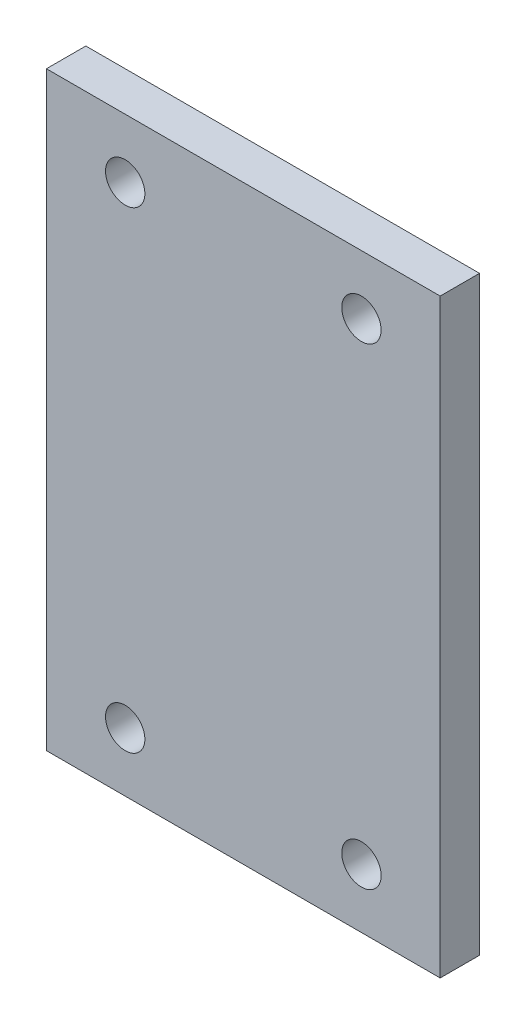
ISO-10303-21;
HEADER;
FILE_DESCRIPTION(('STEP AP214'),'2;1');
FILE_NAME('part.step','',(''),(''),'','','');
FILE_SCHEMA(('AUTOMOTIVE_DESIGN { 1 0 10303 214 1 1 1 1 }'));
ENDSEC;
DATA;
#1=APPLICATION_CONTEXT('core data for automotive mechanical design processes');
#2=APPLICATION_PROTOCOL_DEFINITION('international standard','automotive_design',2000,#1);
#3=PRODUCT_CONTEXT('',#1,'mechanical');
#4=PRODUCT('Part','Part','',(#3));
#5=PRODUCT_RELATED_PRODUCT_CATEGORY('part','',(#4));
#6=PRODUCT_DEFINITION_FORMATION('','',#4);
#7=PRODUCT_DEFINITION_CONTEXT('part definition',#1,'design');
#8=PRODUCT_DEFINITION('design','',#6,#7);
#9=PRODUCT_DEFINITION_SHAPE('','',#8);
#10=(LENGTH_UNIT() NAMED_UNIT(*) SI_UNIT(.MILLI.,.METRE.));
#11=(NAMED_UNIT(*) PLANE_ANGLE_UNIT() SI_UNIT($,.RADIAN.));
#12=(NAMED_UNIT(*) SI_UNIT($,.STERADIAN.) SOLID_ANGLE_UNIT());
#13=UNCERTAINTY_MEASURE_WITH_UNIT(LENGTH_MEASURE(1.E-05),#10,'distance_accuracy_value','');
#14=(GEOMETRIC_REPRESENTATION_CONTEXT(3) GLOBAL_UNCERTAINTY_ASSIGNED_CONTEXT((#13)) GLOBAL_UNIT_ASSIGNED_CONTEXT((#10,
#11,#12)) REPRESENTATION_CONTEXT('',''));
#15=CARTESIAN_POINT('',(0.,0.,0.));
#16=DIRECTION('',(0.,0.,1.));
#17=DIRECTION('',(1.,0.,0.));
#18=AXIS2_PLACEMENT_3D('',#15,#16,#17);
#19=CARTESIAN_POINT('',(0.,0.,5.08));
#20=DIRECTION('',(0.,0.,1.));
#21=DIRECTION('',(1.,0.,0.));
#22=AXIS2_PLACEMENT_3D('',#19,#20,#21);
#23=PLANE('',#22);
#24=CARTESIAN_POINT('',(-8.00410597528841,86.5222128549228,5.08));
#25=DIRECTION('',(0.,0.,1.));
#26=DIRECTION('',(1.,0.,0.));
#27=AXIS2_PLACEMENT_3D('',#24,#25,#26);
#28=CIRCLE('',#27,2.54);
#29=CARTESIAN_POINT('',(-5.46410597528841,86.5222128549228,5.08));
#30=VERTEX_POINT('',#29);
#31=EDGE_CURVE('E146',#30,#30,#28,.T.);
#32=ORIENTED_EDGE('',*,*,#31,.F.);
#33=EDGE_LOOP('',(#32));
#34=FACE_BOUND('',#33,.T.);
#35=CARTESIAN_POINT('',(-38.4841059752884,25.5622128549228,5.08));
#36=DIRECTION('',(0.,0.,1.));
#37=DIRECTION('',(1.,0.,0.));
#38=AXIS2_PLACEMENT_3D('',#35,#36,#37);
#39=CIRCLE('',#38,2.54);
#40=CARTESIAN_POINT('',(-35.9441059752884,25.5622128549228,5.08));
#41=VERTEX_POINT('',#40);
#42=EDGE_CURVE('E120',#41,#41,#39,.T.);
#43=ORIENTED_EDGE('',*,*,#42,.F.);
#44=EDGE_LOOP('',(#43));
#45=FACE_BOUND('',#44,.T.);
#46=DIRECTION('',(0.,1.,0.));
#47=VECTOR('',#46,1.);
#48=CARTESIAN_POINT('',(2.15589402471159,94.1422128549228,5.08));
#49=LINE('',#48,#47);
#50=CARTESIAN_POINT('',(2.15589402471159,17.9422128549228,5.08));
#51=VERTEX_POINT('',#50);
#52=CARTESIAN_POINT('',(2.15589402471159,94.1422128549228,5.08));
#53=VERTEX_POINT('',#52);
#54=EDGE_CURVE('E98',#51,#53,#49,.T.);
#55=ORIENTED_EDGE('',*,*,#54,.T.);
#56=DIRECTION('',(-1.,0.,0.));
#57=VECTOR('',#56,1.);
#58=CARTESIAN_POINT('',(-48.6441059752884,94.1422128549228,5.08));
#59=LINE('',#58,#57);
#60=CARTESIAN_POINT('',(-48.6441059752884,94.1422128549228,5.08));
#61=VERTEX_POINT('',#60);
#62=EDGE_CURVE('E91',#53,#61,#59,.T.);
#63=ORIENTED_EDGE('',*,*,#62,.T.);
#64=DIRECTION('',(0.,-1.,0.));
#65=VECTOR('',#64,1.);
#66=CARTESIAN_POINT('',(-48.6441059752884,94.1422128549228,5.08));
#67=LINE('',#66,#65);
#68=CARTESIAN_POINT('',(-48.6441059752884,17.9422128549228,5.08));
#69=VERTEX_POINT('',#68);
#70=EDGE_CURVE('E96',#61,#69,#67,.T.);
#71=ORIENTED_EDGE('',*,*,#70,.T.);
#72=DIRECTION('',(1.,0.,0.));
#73=VECTOR('',#72,1.);
#74=CARTESIAN_POINT('',(-48.6441059752884,17.9422128549228,5.08));
#75=LINE('',#74,#73);
#76=EDGE_CURVE('E65',#69,#51,#75,.T.);
#77=ORIENTED_EDGE('',*,*,#76,.T.);
#78=EDGE_LOOP('',(#55,#63,#71,#77));
#79=FACE_BOUND('',#78,.T.);
#80=CARTESIAN_POINT('',(-8.00410597528842,25.5622128549228,5.08));
#81=DIRECTION('',(0.,0.,1.));
#82=DIRECTION('',(-1.,0.,0.));
#83=AXIS2_PLACEMENT_3D('',#80,#81,#82);
#84=CIRCLE('',#83,2.54);
#85=CARTESIAN_POINT('',(-10.5441059752884,25.5622128549228,5.08));
#86=VERTEX_POINT('',#85);
#87=EDGE_CURVE('E139',#86,#86,#84,.T.);
#88=ORIENTED_EDGE('',*,*,#87,.F.);
#89=EDGE_LOOP('',(#88));
#90=FACE_BOUND('',#89,.T.);
#91=CARTESIAN_POINT('',(-38.4841059752884,86.5222128549228,5.08));
#92=DIRECTION('',(0.,0.,1.));
#93=DIRECTION('',(-1.,0.,0.));
#94=AXIS2_PLACEMENT_3D('',#91,#92,#93);
#95=CIRCLE('',#94,2.54);
#96=CARTESIAN_POINT('',(-41.0241059752884,86.5222128549228,5.08));
#97=VERTEX_POINT('',#96);
#98=EDGE_CURVE('E156',#97,#97,#95,.T.);
#99=ORIENTED_EDGE('',*,*,#98,.F.);
#100=EDGE_LOOP('',(#99));
#101=FACE_BOUND('',#100,.T.);
#102=ADVANCED_FACE('F44',(#34,#45,#79,#90,#101),#23,.T.);
#103=CARTESIAN_POINT('',(0.,0.,0.));
#104=DIRECTION('',(0.,0.,1.));
#105=DIRECTION('',(1.,0.,0.));
#106=AXIS2_PLACEMENT_3D('',#103,#104,#105);
#107=PLANE('',#106);
#108=DIRECTION('',(0.,1.,0.));
#109=VECTOR('',#108,1.);
#110=CARTESIAN_POINT('',(2.15589402471159,94.1422128549228,0.));
#111=LINE('',#110,#109);
#112=CARTESIAN_POINT('',(2.15589402471159,17.9422128549228,0.));
#113=VERTEX_POINT('',#112);
#114=CARTESIAN_POINT('',(2.15589402471159,94.1422128549228,0.));
#115=VERTEX_POINT('',#114);
#116=EDGE_CURVE('E111',#113,#115,#111,.T.);
#117=ORIENTED_EDGE('',*,*,#116,.F.);
#118=DIRECTION('',(1.,0.,0.));
#119=VECTOR('',#118,1.);
#120=CARTESIAN_POINT('',(-48.6441059752884,17.9422128549228,0.));
#121=LINE('',#120,#119);
#122=CARTESIAN_POINT('',(-48.6441059752884,17.9422128549228,0.));
#123=VERTEX_POINT('',#122);
#124=EDGE_CURVE('E88',#123,#113,#121,.T.);
#125=ORIENTED_EDGE('',*,*,#124,.F.);
#126=DIRECTION('',(0.,-1.,0.));
#127=VECTOR('',#126,1.);
#128=CARTESIAN_POINT('',(-48.6441059752884,94.1422128549228,0.));
#129=LINE('',#128,#127);
#130=CARTESIAN_POINT('',(-48.6441059752884,94.1422128549228,0.));
#131=VERTEX_POINT('',#130);
#132=EDGE_CURVE('E77',#131,#123,#129,.T.);
#133=ORIENTED_EDGE('',*,*,#132,.F.);
#134=DIRECTION('',(-1.,0.,0.));
#135=VECTOR('',#134,1.);
#136=CARTESIAN_POINT('',(-48.6441059752884,94.1422128549228,0.));
#137=LINE('',#136,#135);
#138=EDGE_CURVE('E103',#115,#131,#137,.T.);
#139=ORIENTED_EDGE('',*,*,#138,.F.);
#140=EDGE_LOOP('',(#117,#125,#133,#139));
#141=FACE_BOUND('',#140,.T.);
#142=CARTESIAN_POINT('',(-38.4841059752884,25.5622128549228,0.));
#143=DIRECTION('',(0.,0.,1.));
#144=DIRECTION('',(1.,0.,0.));
#145=AXIS2_PLACEMENT_3D('',#142,#143,#144);
#146=CIRCLE('',#145,2.54);
#147=CARTESIAN_POINT('',(-35.9441059752884,25.5622128549228,0.));
#148=VERTEX_POINT('',#147);
#149=EDGE_CURVE('E136',#148,#148,#146,.T.);
#150=ORIENTED_EDGE('',*,*,#149,.T.);
#151=EDGE_LOOP('',(#150));
#152=FACE_BOUND('',#151,.T.);
#153=CARTESIAN_POINT('',(-8.00410597528842,25.5622128549228,0.));
#154=DIRECTION('',(0.,0.,1.));
#155=DIRECTION('',(-1.,0.,0.));
#156=AXIS2_PLACEMENT_3D('',#153,#154,#155);
#157=CIRCLE('',#156,2.54);
#158=CARTESIAN_POINT('',(-10.5441059752884,25.5622128549228,0.));
#159=VERTEX_POINT('',#158);
#160=EDGE_CURVE('E145',#159,#159,#157,.T.);
#161=ORIENTED_EDGE('',*,*,#160,.T.);
#162=EDGE_LOOP('',(#161));
#163=FACE_BOUND('',#162,.T.);
#164=CARTESIAN_POINT('',(-8.00410597528841,86.5222128549228,0.));
#165=DIRECTION('',(0.,0.,1.));
#166=DIRECTION('',(1.,0.,0.));
#167=AXIS2_PLACEMENT_3D('',#164,#165,#166);
#168=CIRCLE('',#167,2.54);
#169=CARTESIAN_POINT('',(-5.46410597528841,86.5222128549228,0.));
#170=VERTEX_POINT('',#169);
#171=EDGE_CURVE('E155',#170,#170,#168,.T.);
#172=ORIENTED_EDGE('',*,*,#171,.T.);
#173=EDGE_LOOP('',(#172));
#174=FACE_BOUND('',#173,.T.);
#175=CARTESIAN_POINT('',(-38.4841059752884,86.5222128549228,0.));
#176=DIRECTION('',(0.,0.,1.));
#177=DIRECTION('',(-1.,0.,0.));
#178=AXIS2_PLACEMENT_3D('',#175,#176,#177);
#179=CIRCLE('',#178,2.54);
#180=CARTESIAN_POINT('',(-41.0241059752884,86.5222128549228,0.));
#181=VERTEX_POINT('',#180);
#182=EDGE_CURVE('E159',#181,#181,#179,.T.);
#183=ORIENTED_EDGE('',*,*,#182,.T.);
#184=EDGE_LOOP('',(#183));
#185=FACE_BOUND('',#184,.T.);
#186=ADVANCED_FACE('F134',(#141,#152,#163,#174,#185),#107,.F.);
#187=CARTESIAN_POINT('',(2.15589402471159,94.1422128549228,5.08));
#188=DIRECTION('',(-1.,0.,0.));
#189=DIRECTION('',(0.,-1.,0.));
#190=AXIS2_PLACEMENT_3D('',#187,#188,#189);
#191=PLANE('',#190);
#192=ORIENTED_EDGE('',*,*,#116,.T.);
#193=DIRECTION('',(0.,0.,-1.));
#194=VECTOR('',#193,1.);
#195=CARTESIAN_POINT('',(2.15589402471159,94.1422128549228,5.08));
#196=LINE('',#195,#194);
#197=EDGE_CURVE('E11',#53,#115,#196,.T.);
#198=ORIENTED_EDGE('',*,*,#197,.F.);
#199=ORIENTED_EDGE('',*,*,#54,.F.);
#200=DIRECTION('',(0.,0.,-1.));
#201=VECTOR('',#200,1.);
#202=CARTESIAN_POINT('',(2.15589402471159,17.9422128549228,5.08));
#203=LINE('',#202,#201);
#204=EDGE_CURVE('E109',#51,#113,#203,.T.);
#205=ORIENTED_EDGE('',*,*,#204,.T.);
#206=EDGE_LOOP('',(#192,#198,#199,#205));
#207=FACE_BOUND('',#206,.T.);
#208=ADVANCED_FACE('F50',(#207),#191,.F.);
#209=CARTESIAN_POINT('',(-48.6441059752884,94.1422128549228,5.08));
#210=DIRECTION('',(0.,-1.,0.));
#211=DIRECTION('',(0.,0.,-1.));
#212=AXIS2_PLACEMENT_3D('',#209,#210,#211);
#213=PLANE('',#212);
#214=ORIENTED_EDGE('',*,*,#138,.T.);
#215=DIRECTION('',(0.,0.,-1.));
#216=VECTOR('',#215,1.);
#217=CARTESIAN_POINT('',(-48.6441059752884,94.1422128549228,5.08));
#218=LINE('',#217,#216);
#219=EDGE_CURVE('E54',#61,#131,#218,.T.);
#220=ORIENTED_EDGE('',*,*,#219,.F.);
#221=ORIENTED_EDGE('',*,*,#62,.F.);
#222=ORIENTED_EDGE('',*,*,#197,.T.);
#223=EDGE_LOOP('',(#214,#220,#221,#222));
#224=FACE_BOUND('',#223,.T.);
#225=ADVANCED_FACE('F105',(#224),#213,.F.);
#226=CARTESIAN_POINT('',(-48.6441059752884,94.1422128549228,5.08));
#227=DIRECTION('',(1.,0.,0.));
#228=DIRECTION('',(0.,1.,0.));
#229=AXIS2_PLACEMENT_3D('',#226,#227,#228);
#230=PLANE('',#229);
#231=ORIENTED_EDGE('',*,*,#132,.T.);
#232=DIRECTION('',(0.,0.,-1.));
#233=VECTOR('',#232,1.);
#234=CARTESIAN_POINT('',(-48.6441059752884,17.9422128549228,5.08));
#235=LINE('',#234,#233);
#236=EDGE_CURVE('E104',#69,#123,#235,.T.);
#237=ORIENTED_EDGE('',*,*,#236,.F.);
#238=ORIENTED_EDGE('',*,*,#70,.F.);
#239=ORIENTED_EDGE('',*,*,#219,.T.);
#240=EDGE_LOOP('',(#231,#237,#238,#239));
#241=FACE_BOUND('',#240,.T.);
#242=ADVANCED_FACE('F106',(#241),#230,.F.);
#243=CARTESIAN_POINT('',(-48.6441059752884,17.9422128549228,5.08));
#244=DIRECTION('',(0.,1.,0.));
#245=DIRECTION('',(0.,0.,1.));
#246=AXIS2_PLACEMENT_3D('',#243,#244,#245);
#247=PLANE('',#246);
#248=CARTESIAN_POINT('',(-38.4381592352376,17.9422128549228,2.54));
#249=DIRECTION('',(0.,-1.,0.));
#250=DIRECTION('',(0.,0.,-1.));
#251=AXIS2_PLACEMENT_3D('',#248,#249,#250);
#252=CIRCLE('',#251,2.1);
#253=CARTESIAN_POINT('',(-38.4381592352376,17.9422128549228,0.440000000000003));
#254=VERTEX_POINT('',#253);
#255=EDGE_CURVE('E176',#254,#254,#252,.T.);
#256=ORIENTED_EDGE('',*,*,#255,.F.);
#257=EDGE_LOOP('',(#256));
#258=FACE_BOUND('',#257,.T.);
#259=CARTESIAN_POINT('',(-8.05005271533918,17.9422128549228,2.54));
#260=DIRECTION('',(0.,-1.,0.));
#261=DIRECTION('',(0.,0.,1.));
#262=AXIS2_PLACEMENT_3D('',#259,#260,#261);
#263=CIRCLE('',#262,2.1);
#264=CARTESIAN_POINT('',(-8.05005271533918,17.9422128549228,4.64));
#265=VERTEX_POINT('',#264);
#266=EDGE_CURVE('E171',#265,#265,#263,.T.);
#267=ORIENTED_EDGE('',*,*,#266,.F.);
#268=EDGE_LOOP('',(#267));
#269=FACE_BOUND('',#268,.T.);
#270=ORIENTED_EDGE('',*,*,#124,.T.);
#271=ORIENTED_EDGE('',*,*,#204,.F.);
#272=ORIENTED_EDGE('',*,*,#76,.F.);
#273=ORIENTED_EDGE('',*,*,#236,.T.);
#274=EDGE_LOOP('',(#270,#271,#272,#273));
#275=FACE_BOUND('',#274,.T.);
#276=ADVANCED_FACE('F126',(#258,#269,#275),#247,.F.);
#277=CARTESIAN_POINT('',(-38.4841059752884,25.5622128549228,5.08));
#278=DIRECTION('',(0.,0.,-1.));
#279=DIRECTION('',(-1.,0.,0.));
#280=AXIS2_PLACEMENT_3D('',#277,#278,#279);
#281=CYLINDRICAL_SURFACE('',#280,2.54);
#282=ORIENTED_EDGE('',*,*,#42,.T.);
#283=EDGE_LOOP('',(#282));
#284=FACE_BOUND('',#283,.T.);
#285=ORIENTED_EDGE('',*,*,#149,.F.);
#286=EDGE_LOOP('',(#285));
#287=FACE_BOUND('',#286,.T.);
#288=ADVANCED_FACE('F194',(#284,#287),#281,.F.);
#289=CARTESIAN_POINT('',(-8.00410597528842,25.5622128549228,5.08));
#290=DIRECTION('',(0.,0.,-1.));
#291=DIRECTION('',(-1.,0.,0.));
#292=AXIS2_PLACEMENT_3D('',#289,#290,#291);
#293=CYLINDRICAL_SURFACE('',#292,2.54);
#294=ORIENTED_EDGE('',*,*,#87,.T.);
#295=EDGE_LOOP('',(#294));
#296=FACE_BOUND('',#295,.T.);
#297=ORIENTED_EDGE('',*,*,#160,.F.);
#298=EDGE_LOOP('',(#297));
#299=FACE_BOUND('',#298,.T.);
#300=ADVANCED_FACE('F266',(#296,#299),#293,.F.);
#301=CARTESIAN_POINT('',(-8.00410597528841,86.5222128549228,5.08));
#302=DIRECTION('',(0.,0.,-1.));
#303=DIRECTION('',(-1.,0.,0.));
#304=AXIS2_PLACEMENT_3D('',#301,#302,#303);
#305=CYLINDRICAL_SURFACE('',#304,2.54);
#306=ORIENTED_EDGE('',*,*,#31,.T.);
#307=EDGE_LOOP('',(#306));
#308=FACE_BOUND('',#307,.T.);
#309=ORIENTED_EDGE('',*,*,#171,.F.);
#310=EDGE_LOOP('',(#309));
#311=FACE_BOUND('',#310,.T.);
#312=ADVANCED_FACE('F209',(#308,#311),#305,.F.);
#313=CARTESIAN_POINT('',(-38.4841059752884,86.5222128549228,5.08));
#314=DIRECTION('',(0.,0.,-1.));
#315=DIRECTION('',(-1.,0.,0.));
#316=AXIS2_PLACEMENT_3D('',#313,#314,#315);
#317=CYLINDRICAL_SURFACE('',#316,2.54);
#318=ORIENTED_EDGE('',*,*,#98,.T.);
#319=EDGE_LOOP('',(#318));
#320=FACE_BOUND('',#319,.T.);
#321=ORIENTED_EDGE('',*,*,#182,.F.);
#322=EDGE_LOOP('',(#321));
#323=FACE_BOUND('',#322,.T.);
#324=ADVANCED_FACE('F203',(#320,#323),#317,.F.);
#325=CARTESIAN_POINT('',(-8.05005271533918,21.9422128549228,2.54));
#326=DIRECTION('',(0.,-1.,0.));
#327=DIRECTION('',(0.,0.,-1.));
#328=AXIS2_PLACEMENT_3D('',#325,#326,#327);
#329=CYLINDRICAL_SURFACE('',#328,2.1);
#330=CARTESIAN_POINT('',(-8.05005271533918,21.9422128549228,2.54));
#331=DIRECTION('',(0.,-1.,0.));
#332=DIRECTION('',(0.,0.,1.));
#333=AXIS2_PLACEMENT_3D('',#330,#331,#332);
#334=CIRCLE('',#333,2.1);
#335=CARTESIAN_POINT('',(-8.05005271533918,21.9422128549228,4.64));
#336=VERTEX_POINT('',#335);
#337=EDGE_CURVE('E169',#336,#336,#334,.T.);
#338=ORIENTED_EDGE('',*,*,#337,.F.);
#339=EDGE_LOOP('',(#338));
#340=FACE_BOUND('',#339,.T.);
#341=ORIENTED_EDGE('',*,*,#266,.T.);
#342=EDGE_LOOP('',(#341));
#343=FACE_BOUND('',#342,.T.);
#344=ADVANCED_FACE('F200',(#340,#343),#329,.F.);
#345=CARTESIAN_POINT('',(-8.05005271533918,21.9422128549228,2.54));
#346=DIRECTION('',(0.,1.,0.));
#347=DIRECTION('',(0.,0.,1.));
#348=AXIS2_PLACEMENT_3D('',#345,#346,#347);
#349=PLANE('',#348);
#350=ORIENTED_EDGE('',*,*,#337,.T.);
#351=EDGE_LOOP('',(#350));
#352=FACE_BOUND('',#351,.T.);
#353=ADVANCED_FACE('F188',(#352),#349,.F.);
#354=CARTESIAN_POINT('',(-38.4381592352376,21.9422128549228,2.54));
#355=DIRECTION('',(0.,-1.,0.));
#356=DIRECTION('',(0.,0.,-1.));
#357=AXIS2_PLACEMENT_3D('',#354,#355,#356);
#358=CYLINDRICAL_SURFACE('',#357,2.1);
#359=CARTESIAN_POINT('',(-38.4381592352376,21.9422128549228,2.54));
#360=DIRECTION('',(0.,-1.,0.));
#361=DIRECTION('',(0.,0.,-1.));
#362=AXIS2_PLACEMENT_3D('',#359,#360,#361);
#363=CIRCLE('',#362,2.1);
#364=CARTESIAN_POINT('',(-38.4381592352376,21.9422128549228,0.440000000000003));
#365=VERTEX_POINT('',#364);
#366=EDGE_CURVE('E163',#365,#365,#363,.T.);
#367=ORIENTED_EDGE('',*,*,#366,.F.);
#368=EDGE_LOOP('',(#367));
#369=FACE_BOUND('',#368,.T.);
#370=ORIENTED_EDGE('',*,*,#255,.T.);
#371=EDGE_LOOP('',(#370));
#372=FACE_BOUND('',#371,.T.);
#373=ADVANCED_FACE('F189',(#369,#372),#358,.F.);
#374=CARTESIAN_POINT('',(-38.4381592352376,21.9422128549228,2.54));
#375=DIRECTION('',(0.,-1.,0.));
#376=DIRECTION('',(0.,0.,-1.));
#377=AXIS2_PLACEMENT_3D('',#374,#375,#376);
#378=PLANE('',#377);
#379=ORIENTED_EDGE('',*,*,#366,.T.);
#380=EDGE_LOOP('',(#379));
#381=FACE_BOUND('',#380,.T.);
#382=ADVANCED_FACE('F184',(#381),#378,.T.);
#383=CLOSED_SHELL('',(#102,#186,#208,#225,#242,#276,#288,#300,#312,#324,#344,#353,#373,#382));
#384=MANIFOLD_SOLID_BREP('B2',#383);
#385=ADVANCED_BREP_SHAPE_REPRESENTATION('',(#18,#384),#14);
#386=SHAPE_DEFINITION_REPRESENTATION(#9,#385);
ENDSEC;
END-ISO-10303-21;
